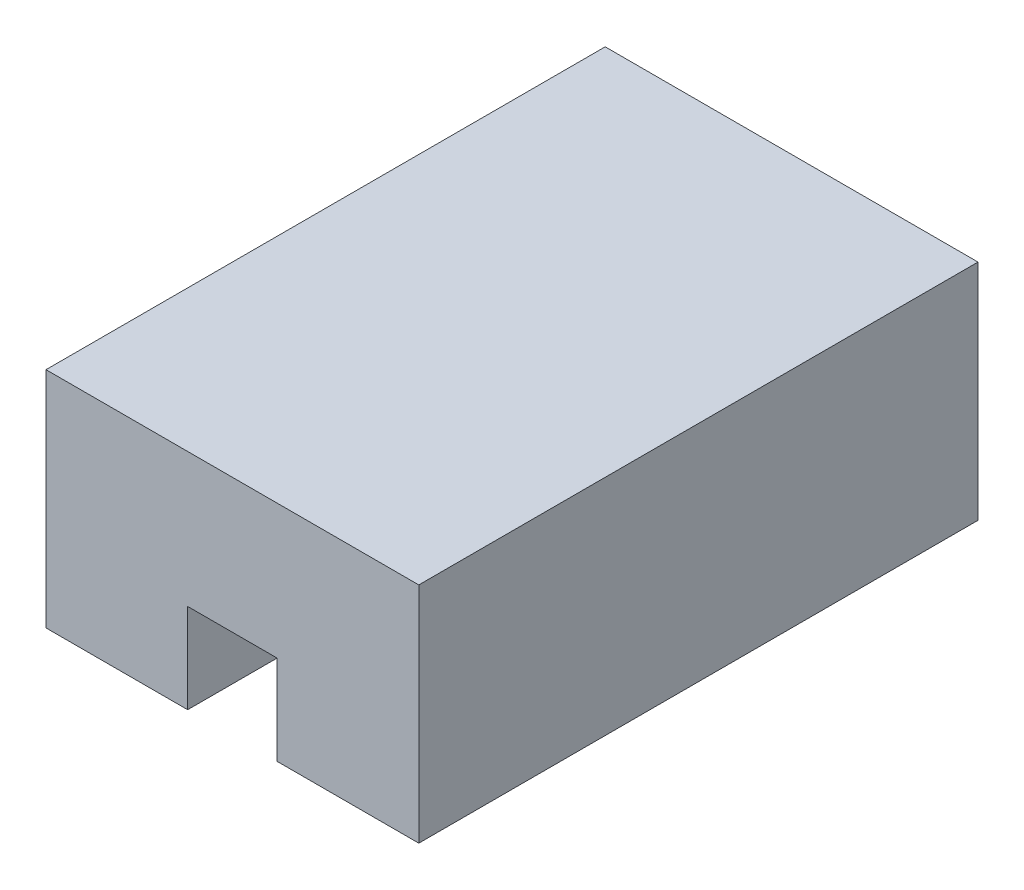
ISO-10303-21;
HEADER;
FILE_DESCRIPTION(('STEP AP214'),'2;1');
FILE_NAME('part.step','',(''),(''),'','','');
FILE_SCHEMA(('AUTOMOTIVE_DESIGN { 1 0 10303 214 1 1 1 1 }'));
ENDSEC;
DATA;
#1=APPLICATION_CONTEXT('core data for automotive mechanical design processes');
#2=APPLICATION_PROTOCOL_DEFINITION('international standard','automotive_design',2000,#1);
#3=PRODUCT_CONTEXT('',#1,'mechanical');
#4=PRODUCT('Part','Part','',(#3));
#5=PRODUCT_RELATED_PRODUCT_CATEGORY('part','',(#4));
#6=PRODUCT_DEFINITION_FORMATION('','',#4);
#7=PRODUCT_DEFINITION_CONTEXT('part definition',#1,'design');
#8=PRODUCT_DEFINITION('design','',#6,#7);
#9=PRODUCT_DEFINITION_SHAPE('','',#8);
#10=(LENGTH_UNIT() NAMED_UNIT(*) SI_UNIT(.MILLI.,.METRE.));
#11=(NAMED_UNIT(*) PLANE_ANGLE_UNIT() SI_UNIT($,.RADIAN.));
#12=(NAMED_UNIT(*) SI_UNIT($,.STERADIAN.) SOLID_ANGLE_UNIT());
#13=UNCERTAINTY_MEASURE_WITH_UNIT(LENGTH_MEASURE(1.E-05),#10,'distance_accuracy_value','');
#14=(GEOMETRIC_REPRESENTATION_CONTEXT(3) GLOBAL_UNCERTAINTY_ASSIGNED_CONTEXT((#13)) GLOBAL_UNIT_ASSIGNED_CONTEXT((#10,
#11,#12)) REPRESENTATION_CONTEXT('',''));
#15=CARTESIAN_POINT('',(0.,0.,0.));
#16=DIRECTION('',(0.,0.,1.));
#17=DIRECTION('',(1.,0.,0.));
#18=AXIS2_PLACEMENT_3D('',#15,#16,#17);
#19=CARTESIAN_POINT('',(0.,-30.,75.));
#20=DIRECTION('',(1.,0.,0.));
#21=DIRECTION('',(0.,0.,-1.));
#22=AXIS2_PLACEMENT_3D('',#19,#20,#21);
#23=PLANE('',#22);
#24=DIRECTION('',(0.,-1.,0.));
#25=VECTOR('',#24,1.);
#26=CARTESIAN_POINT('',(0.,-30.,0.));
#27=LINE('',#26,#25);
#28=CARTESIAN_POINT('',(0.,0.,0.));
#29=VERTEX_POINT('',#28);
#30=CARTESIAN_POINT('',(0.,-30.,0.));
#31=VERTEX_POINT('',#30);
#32=EDGE_CURVE('E129',#29,#31,#27,.T.);
#33=ORIENTED_EDGE('',*,*,#32,.T.);
#34=DIRECTION('',(0.,0.,-1.));
#35=VECTOR('',#34,1.);
#36=CARTESIAN_POINT('',(0.,-30.,75.));
#37=LINE('',#36,#35);
#38=CARTESIAN_POINT('',(0.,-30.,75.));
#39=VERTEX_POINT('',#38);
#40=EDGE_CURVE('E11',#39,#31,#37,.T.);
#41=ORIENTED_EDGE('',*,*,#40,.F.);
#42=DIRECTION('',(0.,-1.,0.));
#43=VECTOR('',#42,1.);
#44=CARTESIAN_POINT('',(0.,-30.,75.));
#45=LINE('',#44,#43);
#46=CARTESIAN_POINT('',(0.,0.,75.));
#47=VERTEX_POINT('',#46);
#48=EDGE_CURVE('E143',#47,#39,#45,.T.);
#49=ORIENTED_EDGE('',*,*,#48,.F.);
#50=DIRECTION('',(0.,0.,-1.));
#51=VECTOR('',#50,1.);
#52=CARTESIAN_POINT('',(0.,0.,75.));
#53=LINE('',#52,#51);
#54=EDGE_CURVE('E125',#47,#29,#53,.T.);
#55=ORIENTED_EDGE('',*,*,#54,.T.);
#56=EDGE_LOOP('',(#33,#41,#49,#55));
#57=FACE_BOUND('',#56,.T.);
#58=ADVANCED_FACE('F33',(#57),#23,.F.);
#59=CARTESIAN_POINT('',(19.,-30.,75.));
#60=DIRECTION('',(0.,1.,0.));
#61=DIRECTION('',(-1.,0.,0.));
#62=AXIS2_PLACEMENT_3D('',#59,#60,#61);
#63=PLANE('',#62);
#64=DIRECTION('',(1.,0.,0.));
#65=VECTOR('',#64,1.);
#66=CARTESIAN_POINT('',(19.,-30.,0.));
#67=LINE('',#66,#65);
#68=CARTESIAN_POINT('',(19.,-30.,0.));
#69=VERTEX_POINT('',#68);
#70=EDGE_CURVE('E132',#31,#69,#67,.T.);
#71=ORIENTED_EDGE('',*,*,#70,.T.);
#72=DIRECTION('',(0.,0.,-1.));
#73=VECTOR('',#72,1.);
#74=CARTESIAN_POINT('',(19.,-30.,75.));
#75=LINE('',#74,#73);
#76=CARTESIAN_POINT('',(19.,-30.,75.));
#77=VERTEX_POINT('',#76);
#78=EDGE_CURVE('E41',#77,#69,#75,.T.);
#79=ORIENTED_EDGE('',*,*,#78,.F.);
#80=DIRECTION('',(1.,0.,0.));
#81=VECTOR('',#80,1.);
#82=CARTESIAN_POINT('',(19.,-30.,75.));
#83=LINE('',#82,#81);
#84=EDGE_CURVE('E92',#39,#77,#83,.T.);
#85=ORIENTED_EDGE('',*,*,#84,.F.);
#86=ORIENTED_EDGE('',*,*,#40,.T.);
#87=EDGE_LOOP('',(#71,#79,#85,#86));
#88=FACE_BOUND('',#87,.T.);
#89=ADVANCED_FACE('F178',(#88),#63,.F.);
#90=CARTESIAN_POINT('',(19.,-18.,75.));
#91=DIRECTION('',(-1.,0.,0.));
#92=DIRECTION('',(0.,0.,1.));
#93=AXIS2_PLACEMENT_3D('',#90,#91,#92);
#94=PLANE('',#93);
#95=DIRECTION('',(0.,1.,0.));
#96=VECTOR('',#95,1.);
#97=CARTESIAN_POINT('',(19.,-18.,0.));
#98=LINE('',#97,#96);
#99=CARTESIAN_POINT('',(19.,-18.,0.));
#100=VERTEX_POINT('',#99);
#101=EDGE_CURVE('E134',#69,#100,#98,.T.);
#102=ORIENTED_EDGE('',*,*,#101,.T.);
#103=DIRECTION('',(0.,0.,-1.));
#104=VECTOR('',#103,1.);
#105=CARTESIAN_POINT('',(19.,-18.,75.));
#106=LINE('',#105,#104);
#107=CARTESIAN_POINT('',(19.,-18.,75.));
#108=VERTEX_POINT('',#107);
#109=EDGE_CURVE('E150',#108,#100,#106,.T.);
#110=ORIENTED_EDGE('',*,*,#109,.F.);
#111=DIRECTION('',(0.,1.,0.));
#112=VECTOR('',#111,1.);
#113=CARTESIAN_POINT('',(19.,-18.,75.));
#114=LINE('',#113,#112);
#115=EDGE_CURVE('E158',#77,#108,#114,.T.);
#116=ORIENTED_EDGE('',*,*,#115,.F.);
#117=ORIENTED_EDGE('',*,*,#78,.T.);
#118=EDGE_LOOP('',(#102,#110,#116,#117));
#119=FACE_BOUND('',#118,.T.);
#120=ADVANCED_FACE('F156',(#119),#94,.F.);
#121=CARTESIAN_POINT('',(31.,-18.,75.));
#122=DIRECTION('',(0.,1.,0.));
#123=DIRECTION('',(0.,0.,1.));
#124=AXIS2_PLACEMENT_3D('',#121,#122,#123);
#125=PLANE('',#124);
#126=DIRECTION('',(1.,0.,0.));
#127=VECTOR('',#126,1.);
#128=CARTESIAN_POINT('',(31.,-18.,0.));
#129=LINE('',#128,#127);
#130=CARTESIAN_POINT('',(31.,-18.,0.));
#131=VERTEX_POINT('',#130);
#132=EDGE_CURVE('E136',#100,#131,#129,.T.);
#133=ORIENTED_EDGE('',*,*,#132,.T.);
#134=DIRECTION('',(0.,0.,-1.));
#135=VECTOR('',#134,1.);
#136=CARTESIAN_POINT('',(31.,-18.,75.));
#137=LINE('',#136,#135);
#138=CARTESIAN_POINT('',(31.,-18.,75.));
#139=VERTEX_POINT('',#138);
#140=EDGE_CURVE('E147',#139,#131,#137,.T.);
#141=ORIENTED_EDGE('',*,*,#140,.F.);
#142=DIRECTION('',(1.,0.,0.));
#143=VECTOR('',#142,1.);
#144=CARTESIAN_POINT('',(31.,-18.,75.));
#145=LINE('',#144,#143);
#146=EDGE_CURVE('E170',#108,#139,#145,.T.);
#147=ORIENTED_EDGE('',*,*,#146,.F.);
#148=ORIENTED_EDGE('',*,*,#109,.T.);
#149=EDGE_LOOP('',(#133,#141,#147,#148));
#150=FACE_BOUND('',#149,.T.);
#151=ADVANCED_FACE('F166',(#150),#125,.F.);
#152=CARTESIAN_POINT('',(31.,-30.,75.));
#153=DIRECTION('',(1.,0.,0.));
#154=DIRECTION('',(0.,0.,-1.));
#155=AXIS2_PLACEMENT_3D('',#152,#153,#154);
#156=PLANE('',#155);
#157=DIRECTION('',(0.,-1.,0.));
#158=VECTOR('',#157,1.);
#159=CARTESIAN_POINT('',(31.,-30.,0.));
#160=LINE('',#159,#158);
#161=CARTESIAN_POINT('',(31.,-30.,0.));
#162=VERTEX_POINT('',#161);
#163=EDGE_CURVE('E138',#131,#162,#160,.T.);
#164=ORIENTED_EDGE('',*,*,#163,.T.);
#165=DIRECTION('',(0.,0.,-1.));
#166=VECTOR('',#165,1.);
#167=CARTESIAN_POINT('',(31.,-30.,75.));
#168=LINE('',#167,#166);
#169=CARTESIAN_POINT('',(31.,-30.,75.));
#170=VERTEX_POINT('',#169);
#171=EDGE_CURVE('E120',#170,#162,#168,.T.);
#172=ORIENTED_EDGE('',*,*,#171,.F.);
#173=DIRECTION('',(0.,-1.,0.));
#174=VECTOR('',#173,1.);
#175=CARTESIAN_POINT('',(31.,-30.,75.));
#176=LINE('',#175,#174);
#177=EDGE_CURVE('E111',#139,#170,#176,.T.);
#178=ORIENTED_EDGE('',*,*,#177,.F.);
#179=ORIENTED_EDGE('',*,*,#140,.T.);
#180=EDGE_LOOP('',(#164,#172,#178,#179));
#181=FACE_BOUND('',#180,.T.);
#182=ADVANCED_FACE('F169',(#181),#156,.F.);
#183=CARTESIAN_POINT('',(50.,-30.,75.));
#184=DIRECTION('',(0.,1.,0.));
#185=DIRECTION('',(-1.,0.,0.));
#186=AXIS2_PLACEMENT_3D('',#183,#184,#185);
#187=PLANE('',#186);
#188=DIRECTION('',(1.,0.,0.));
#189=VECTOR('',#188,1.);
#190=CARTESIAN_POINT('',(50.,-30.,0.));
#191=LINE('',#190,#189);
#192=CARTESIAN_POINT('',(50.,-30.,0.));
#193=VERTEX_POINT('',#192);
#194=EDGE_CURVE('E119',#162,#193,#191,.T.);
#195=ORIENTED_EDGE('',*,*,#194,.T.);
#196=DIRECTION('',(0.,0.,-1.));
#197=VECTOR('',#196,1.);
#198=CARTESIAN_POINT('',(50.,-30.,75.));
#199=LINE('',#198,#197);
#200=CARTESIAN_POINT('',(50.,-30.,75.));
#201=VERTEX_POINT('',#200);
#202=EDGE_CURVE('E116',#201,#193,#199,.T.);
#203=ORIENTED_EDGE('',*,*,#202,.F.);
#204=DIRECTION('',(1.,0.,0.));
#205=VECTOR('',#204,1.);
#206=CARTESIAN_POINT('',(50.,-30.,75.));
#207=LINE('',#206,#205);
#208=EDGE_CURVE('E105',#170,#201,#207,.T.);
#209=ORIENTED_EDGE('',*,*,#208,.F.);
#210=ORIENTED_EDGE('',*,*,#171,.T.);
#211=EDGE_LOOP('',(#195,#203,#209,#210));
#212=FACE_BOUND('',#211,.T.);
#213=ADVANCED_FACE('F117',(#212),#187,.F.);
#214=CARTESIAN_POINT('',(50.,0.,75.));
#215=DIRECTION('',(-1.,0.,0.));
#216=DIRECTION('',(0.,-1.,0.));
#217=AXIS2_PLACEMENT_3D('',#214,#215,#216);
#218=PLANE('',#217);
#219=DIRECTION('',(0.,1.,0.));
#220=VECTOR('',#219,1.);
#221=CARTESIAN_POINT('',(50.,0.,0.));
#222=LINE('',#221,#220);
#223=CARTESIAN_POINT('',(50.,0.,0.));
#224=VERTEX_POINT('',#223);
#225=EDGE_CURVE('E78',#193,#224,#222,.T.);
#226=ORIENTED_EDGE('',*,*,#225,.T.);
#227=DIRECTION('',(0.,0.,-1.));
#228=VECTOR('',#227,1.);
#229=CARTESIAN_POINT('',(50.,0.,75.));
#230=LINE('',#229,#228);
#231=CARTESIAN_POINT('',(50.,0.,75.));
#232=VERTEX_POINT('',#231);
#233=EDGE_CURVE('E121',#232,#224,#230,.T.);
#234=ORIENTED_EDGE('',*,*,#233,.F.);
#235=DIRECTION('',(0.,1.,0.));
#236=VECTOR('',#235,1.);
#237=CARTESIAN_POINT('',(50.,0.,75.));
#238=LINE('',#237,#236);
#239=EDGE_CURVE('E109',#201,#232,#238,.T.);
#240=ORIENTED_EDGE('',*,*,#239,.F.);
#241=ORIENTED_EDGE('',*,*,#202,.T.);
#242=EDGE_LOOP('',(#226,#234,#240,#241));
#243=FACE_BOUND('',#242,.T.);
#244=ADVANCED_FACE('F123',(#243),#218,.F.);
#245=CARTESIAN_POINT('',(0.,0.,75.));
#246=DIRECTION('',(0.,-1.,0.));
#247=DIRECTION('',(0.,0.,-1.));
#248=AXIS2_PLACEMENT_3D('',#245,#246,#247);
#249=PLANE('',#248);
#250=DIRECTION('',(-1.,0.,0.));
#251=VECTOR('',#250,1.);
#252=CARTESIAN_POINT('',(0.,0.,0.));
#253=LINE('',#252,#251);
#254=EDGE_CURVE('E84',#224,#29,#253,.T.);
#255=ORIENTED_EDGE('',*,*,#254,.T.);
#256=ORIENTED_EDGE('',*,*,#54,.F.);
#257=DIRECTION('',(-1.,0.,0.));
#258=VECTOR('',#257,1.);
#259=CARTESIAN_POINT('',(0.,0.,75.));
#260=LINE('',#259,#258);
#261=EDGE_CURVE('E49',#232,#47,#260,.T.);
#262=ORIENTED_EDGE('',*,*,#261,.F.);
#263=ORIENTED_EDGE('',*,*,#233,.T.);
#264=EDGE_LOOP('',(#255,#256,#262,#263));
#265=FACE_BOUND('',#264,.T.);
#266=ADVANCED_FACE('F194',(#265),#249,.F.);
#267=CARTESIAN_POINT('',(0.,0.,75.));
#268=DIRECTION('',(0.,0.,-1.));
#269=DIRECTION('',(-1.,0.,0.));
#270=AXIS2_PLACEMENT_3D('',#267,#268,#269);
#271=PLANE('',#270);
#272=ORIENTED_EDGE('',*,*,#48,.T.);
#273=ORIENTED_EDGE('',*,*,#84,.T.);
#274=ORIENTED_EDGE('',*,*,#115,.T.);
#275=ORIENTED_EDGE('',*,*,#146,.T.);
#276=ORIENTED_EDGE('',*,*,#177,.T.);
#277=ORIENTED_EDGE('',*,*,#208,.T.);
#278=ORIENTED_EDGE('',*,*,#239,.T.);
#279=ORIENTED_EDGE('',*,*,#261,.T.);
#280=EDGE_LOOP('',(#272,#273,#274,#275,#276,#277,#278,#279));
#281=FACE_BOUND('',#280,.T.);
#282=ADVANCED_FACE('F107',(#281),#271,.F.);
#283=CARTESIAN_POINT('',(0.,0.,0.));
#284=DIRECTION('',(0.,0.,-1.));
#285=DIRECTION('',(-1.,0.,0.));
#286=AXIS2_PLACEMENT_3D('',#283,#284,#285);
#287=PLANE('',#286);
#288=ORIENTED_EDGE('',*,*,#32,.F.);
#289=ORIENTED_EDGE('',*,*,#254,.F.);
#290=ORIENTED_EDGE('',*,*,#225,.F.);
#291=ORIENTED_EDGE('',*,*,#194,.F.);
#292=ORIENTED_EDGE('',*,*,#163,.F.);
#293=ORIENTED_EDGE('',*,*,#132,.F.);
#294=ORIENTED_EDGE('',*,*,#101,.F.);
#295=ORIENTED_EDGE('',*,*,#70,.F.);
#296=EDGE_LOOP('',(#288,#289,#290,#291,#292,#293,#294,#295));
#297=FACE_BOUND('',#296,.T.);
#298=ADVANCED_FACE('F162',(#297),#287,.T.);
#299=CLOSED_SHELL('',(#58,#89,#120,#151,#182,#213,#244,#266,#282,#298));
#300=MANIFOLD_SOLID_BREP('B2',#299);
#301=ADVANCED_BREP_SHAPE_REPRESENTATION('',(#18,#300),#14);
#302=SHAPE_DEFINITION_REPRESENTATION(#9,#301);
ENDSEC;
END-ISO-10303-21;
